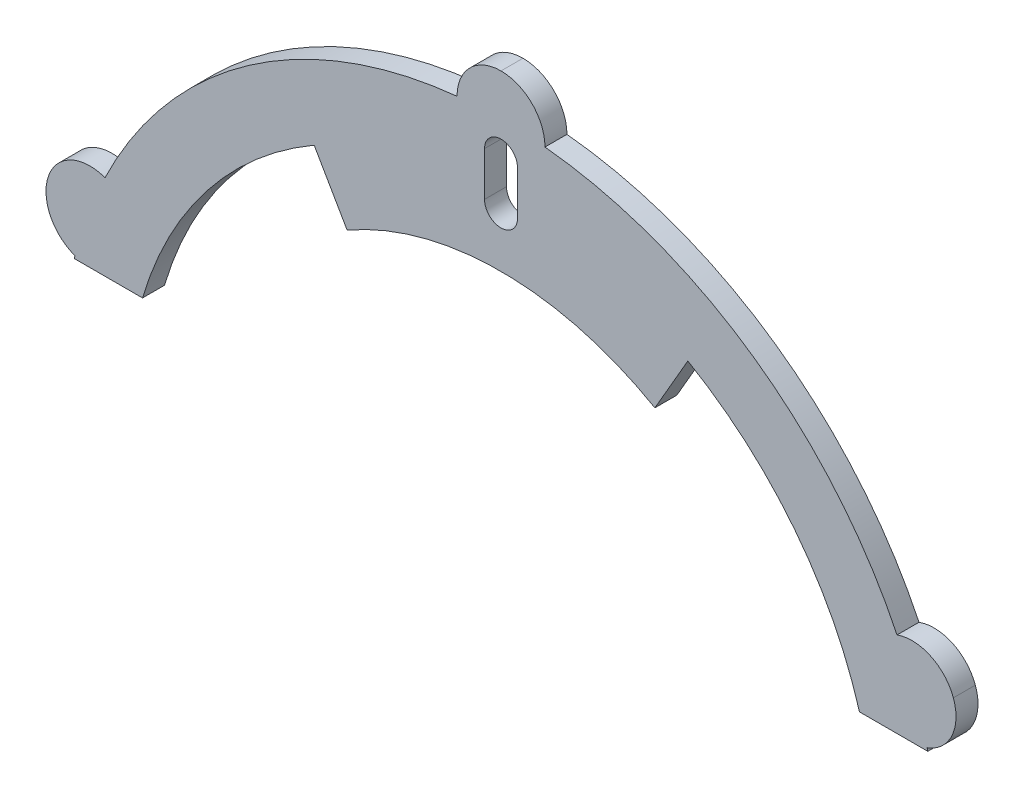
ISO-10303-21;
HEADER;
FILE_DESCRIPTION(('STEP AP214'),'2;1');
FILE_NAME('part.step','',(''),(''),'','','');
FILE_SCHEMA(('AUTOMOTIVE_DESIGN { 1 0 10303 214 1 1 1 1 }'));
ENDSEC;
DATA;
#1=APPLICATION_CONTEXT('core data for automotive mechanical design processes');
#2=APPLICATION_PROTOCOL_DEFINITION('international standard','automotive_design',2000,#1);
#3=PRODUCT_CONTEXT('',#1,'mechanical');
#4=PRODUCT('Part','Part','',(#3));
#5=PRODUCT_RELATED_PRODUCT_CATEGORY('part','',(#4));
#6=PRODUCT_DEFINITION_FORMATION('','',#4);
#7=PRODUCT_DEFINITION_CONTEXT('part definition',#1,'design');
#8=PRODUCT_DEFINITION('design','',#6,#7);
#9=PRODUCT_DEFINITION_SHAPE('','',#8);
#10=(LENGTH_UNIT() NAMED_UNIT(*) SI_UNIT(.MILLI.,.METRE.));
#11=(NAMED_UNIT(*) PLANE_ANGLE_UNIT() SI_UNIT($,.RADIAN.));
#12=(NAMED_UNIT(*) SI_UNIT($,.STERADIAN.) SOLID_ANGLE_UNIT());
#13=UNCERTAINTY_MEASURE_WITH_UNIT(LENGTH_MEASURE(1.E-05),#10,'distance_accuracy_value','');
#14=(GEOMETRIC_REPRESENTATION_CONTEXT(3) GLOBAL_UNCERTAINTY_ASSIGNED_CONTEXT((#13)) GLOBAL_UNIT_ASSIGNED_CONTEXT((#10,
#11,#12)) REPRESENTATION_CONTEXT('',''));
#15=CARTESIAN_POINT('',(0.,0.,0.));
#16=DIRECTION('',(0.,0.,1.));
#17=DIRECTION('',(1.,0.,0.));
#18=AXIS2_PLACEMENT_3D('',#15,#16,#17);
#19=CARTESIAN_POINT('',(0.,0.,6.35));
#20=DIRECTION('',(0.,0.,-1.));
#21=DIRECTION('',(-1.,0.,0.));
#22=AXIS2_PLACEMENT_3D('',#19,#20,#21);
#23=CYLINDRICAL_SURFACE('',#22,127.);
#24=CARTESIAN_POINT('',(0.,0.,0.));
#25=DIRECTION('',(0.,0.,1.));
#26=DIRECTION('',(1.,0.,0.));
#27=AXIS2_PLACEMENT_3D('',#24,#25,#26);
#28=CIRCLE('',#27,127.);
#29=CARTESIAN_POINT('',(-12.7,126.363404512541,0.));
#30=VERTEX_POINT('',#29);
#31=CARTESIAN_POINT('',(-114.399102937584,55.1529260064789,0.));
#32=VERTEX_POINT('',#31);
#33=EDGE_CURVE('E170',#30,#32,#28,.T.);
#34=ORIENTED_EDGE('',*,*,#33,.T.);
#35=DIRECTION('',(0.,0.,-1.));
#36=VECTOR('',#35,1.);
#37=CARTESIAN_POINT('',(-114.399102937584,55.1529260064789,6.35));
#38=LINE('',#37,#36);
#39=CARTESIAN_POINT('',(-114.399102937584,55.1529260064789,6.35));
#40=VERTEX_POINT('',#39);
#41=EDGE_CURVE('E290',#40,#32,#38,.T.);
#42=ORIENTED_EDGE('',*,*,#41,.F.);
#43=CARTESIAN_POINT('',(0.,0.,6.35));
#44=DIRECTION('',(0.,0.,1.));
#45=DIRECTION('',(1.,0.,0.));
#46=AXIS2_PLACEMENT_3D('',#43,#44,#45);
#47=CIRCLE('',#46,127.);
#48=CARTESIAN_POINT('',(-12.7,126.363404512541,6.35));
#49=VERTEX_POINT('',#48);
#50=EDGE_CURVE('E204',#49,#40,#47,.T.);
#51=ORIENTED_EDGE('',*,*,#50,.F.);
#52=DIRECTION('',(0.,0.,-1.));
#53=VECTOR('',#52,1.);
#54=CARTESIAN_POINT('',(-12.7,126.363404512541,6.35));
#55=LINE('',#54,#53);
#56=EDGE_CURVE('E233',#49,#30,#55,.T.);
#57=ORIENTED_EDGE('',*,*,#56,.T.);
#58=EDGE_LOOP('',(#34,#42,#51,#57));
#59=FACE_BOUND('',#58,.T.);
#60=ADVANCED_FACE('F32',(#59),#23,.T.);
#61=CARTESIAN_POINT('',(0.,0.,6.35));
#62=DIRECTION('',(0.,0.,-1.));
#63=DIRECTION('',(-1.,0.,0.));
#64=AXIS2_PLACEMENT_3D('',#61,#62,#63);
#65=CYLINDRICAL_SURFACE('',#64,127.);
#66=CARTESIAN_POINT('',(0.,0.,0.));
#67=DIRECTION('',(0.,0.,1.));
#68=DIRECTION('',(1.,0.,0.));
#69=AXIS2_PLACEMENT_3D('',#66,#67,#68);
#70=CIRCLE('',#69,127.);
#71=CARTESIAN_POINT('',(-123.086414578055,31.2847334385168,0.));
#72=VERTEX_POINT('',#71);
#73=CARTESIAN_POINT('',(-123.288156771038,30.48,0.));
#74=VERTEX_POINT('',#73);
#75=EDGE_CURVE('E173',#72,#74,#70,.T.);
#76=ORIENTED_EDGE('',*,*,#75,.T.);
#77=DIRECTION('',(0.,0.,-1.));
#78=VECTOR('',#77,1.);
#79=CARTESIAN_POINT('',(-123.288156771038,30.48,6.35));
#80=LINE('',#79,#78);
#81=CARTESIAN_POINT('',(-123.288156771038,30.48,6.35));
#82=VERTEX_POINT('',#81);
#83=EDGE_CURVE('E284',#82,#74,#80,.T.);
#84=ORIENTED_EDGE('',*,*,#83,.F.);
#85=CARTESIAN_POINT('',(0.,0.,6.35));
#86=DIRECTION('',(0.,0.,1.));
#87=DIRECTION('',(1.,0.,0.));
#88=AXIS2_PLACEMENT_3D('',#85,#86,#87);
#89=CIRCLE('',#88,127.);
#90=CARTESIAN_POINT('',(-123.086414578055,31.2847334385168,6.35));
#91=VERTEX_POINT('',#90);
#92=EDGE_CURVE('E207',#91,#82,#89,.T.);
#93=ORIENTED_EDGE('',*,*,#92,.F.);
#94=DIRECTION('',(0.,0.,-1.));
#95=VECTOR('',#94,1.);
#96=CARTESIAN_POINT('',(-123.086414578055,31.2847334385168,6.35));
#97=LINE('',#96,#95);
#98=EDGE_CURVE('E287',#91,#72,#97,.T.);
#99=ORIENTED_EDGE('',*,*,#98,.T.);
#100=EDGE_LOOP('',(#76,#84,#93,#99));
#101=FACE_BOUND('',#100,.T.);
#102=ADVANCED_FACE('F322',(#101),#65,.T.);
#103=CARTESIAN_POINT('',(-123.288156771038,30.48,6.35));
#104=DIRECTION('',(0.,1.,0.));
#105=DIRECTION('',(-1.,0.,0.));
#106=AXIS2_PLACEMENT_3D('',#103,#104,#105);
#107=PLANE('',#106);
#108=DIRECTION('',(1.,0.,0.));
#109=VECTOR('',#108,1.);
#110=CARTESIAN_POINT('',(-123.288156771038,30.48,0.));
#111=LINE('',#110,#109);
#112=CARTESIAN_POINT('',(-103.557578670033,30.48,0.));
#113=VERTEX_POINT('',#112);
#114=EDGE_CURVE('E236',#74,#113,#111,.T.);
#115=ORIENTED_EDGE('',*,*,#114,.T.);
#116=DIRECTION('',(0.,0.,-1.));
#117=VECTOR('',#116,1.);
#118=CARTESIAN_POINT('',(-103.557578670033,30.48,6.35));
#119=LINE('',#118,#117);
#120=CARTESIAN_POINT('',(-103.557578670033,30.48,6.35));
#121=VERTEX_POINT('',#120);
#122=EDGE_CURVE('E281',#121,#113,#119,.T.);
#123=ORIENTED_EDGE('',*,*,#122,.F.);
#124=DIRECTION('',(1.,0.,0.));
#125=VECTOR('',#124,1.);
#126=CARTESIAN_POINT('',(-123.288156771038,30.48,6.35));
#127=LINE('',#126,#125);
#128=EDGE_CURVE('E211',#82,#121,#127,.T.);
#129=ORIENTED_EDGE('',*,*,#128,.F.);
#130=ORIENTED_EDGE('',*,*,#83,.T.);
#131=EDGE_LOOP('',(#115,#123,#129,#130));
#132=FACE_BOUND('',#131,.T.);
#133=ADVANCED_FACE('F401',(#132),#107,.F.);
#134=CARTESIAN_POINT('',(0.,0.,6.35));
#135=DIRECTION('',(0.,0.,-1.));
#136=DIRECTION('',(-1.,0.,0.));
#137=AXIS2_PLACEMENT_3D('',#134,#135,#136);
#138=CYLINDRICAL_SURFACE('',#137,107.95);
#139=CARTESIAN_POINT('',(0.,0.,0.));
#140=DIRECTION('',(0.,0.,-1.));
#141=DIRECTION('',(1.,0.,0.));
#142=AXIS2_PLACEMENT_3D('',#139,#140,#141);
#143=CIRCLE('',#142,107.95);
#144=CARTESIAN_POINT('',(-53.9749999999995,93.4874423385304,0.));
#145=VERTEX_POINT('',#144);
#146=EDGE_CURVE('E238',#113,#145,#143,.T.);
#147=ORIENTED_EDGE('',*,*,#146,.T.);
#148=DIRECTION('',(0.,0.,-1.));
#149=VECTOR('',#148,1.);
#150=CARTESIAN_POINT('',(-53.9749999999995,93.4874423385304,6.35));
#151=LINE('',#150,#149);
#152=CARTESIAN_POINT('',(-53.9749999999995,93.4874423385304,6.35));
#153=VERTEX_POINT('',#152);
#154=EDGE_CURVE('E278',#153,#145,#151,.T.);
#155=ORIENTED_EDGE('',*,*,#154,.F.);
#156=CARTESIAN_POINT('',(0.,0.,6.35));
#157=DIRECTION('',(0.,0.,-1.));
#158=DIRECTION('',(1.,0.,0.));
#159=AXIS2_PLACEMENT_3D('',#156,#157,#158);
#160=CIRCLE('',#159,107.95);
#161=EDGE_CURVE('E214',#121,#153,#160,.T.);
#162=ORIENTED_EDGE('',*,*,#161,.F.);
#163=ORIENTED_EDGE('',*,*,#122,.T.);
#164=EDGE_LOOP('',(#147,#155,#162,#163));
#165=FACE_BOUND('',#164,.T.);
#166=ADVANCED_FACE('F398',(#165),#138,.F.);
#167=CARTESIAN_POINT('',(-44.4499999999996,76.9896583964368,6.35));
#168=DIRECTION('',(0.866025403784441,0.499999999999995,0.));
#169=DIRECTION('',(-0.499999999999995,0.866025403784441,0.));
#170=AXIS2_PLACEMENT_3D('',#167,#168,#169);
#171=PLANE('',#170);
#172=DIRECTION('',(0.499999999999995,-0.866025403784441,0.));
#173=VECTOR('',#172,1.);
#174=CARTESIAN_POINT('',(-44.4499999999996,76.9896583964368,0.));
#175=LINE('',#174,#173);
#176=CARTESIAN_POINT('',(-44.4499999999996,76.9896583964368,0.));
#177=VERTEX_POINT('',#176);
#178=EDGE_CURVE('E240',#145,#177,#175,.T.);
#179=ORIENTED_EDGE('',*,*,#178,.T.);
#180=DIRECTION('',(0.,0.,-1.));
#181=VECTOR('',#180,1.);
#182=CARTESIAN_POINT('',(-44.4499999999996,76.9896583964368,6.35));
#183=LINE('',#182,#181);
#184=CARTESIAN_POINT('',(-44.4499999999996,76.9896583964368,6.35));
#185=VERTEX_POINT('',#184);
#186=EDGE_CURVE('E275',#185,#177,#183,.T.);
#187=ORIENTED_EDGE('',*,*,#186,.F.);
#188=DIRECTION('',(0.499999999999995,-0.866025403784441,0.));
#189=VECTOR('',#188,1.);
#190=CARTESIAN_POINT('',(-44.4499999999996,76.9896583964368,6.35));
#191=LINE('',#190,#189);
#192=EDGE_CURVE('E217',#153,#185,#191,.T.);
#193=ORIENTED_EDGE('',*,*,#192,.F.);
#194=ORIENTED_EDGE('',*,*,#154,.T.);
#195=EDGE_LOOP('',(#179,#187,#193,#194));
#196=FACE_BOUND('',#195,.T.);
#197=ADVANCED_FACE('F393',(#196),#171,.F.);
#198=CARTESIAN_POINT('',(0.,0.,6.35));
#199=DIRECTION('',(0.,0.,-1.));
#200=DIRECTION('',(-1.,0.,0.));
#201=AXIS2_PLACEMENT_3D('',#198,#199,#200);
#202=CYLINDRICAL_SURFACE('',#201,88.9);
#203=CARTESIAN_POINT('',(0.,0.,0.));
#204=DIRECTION('',(0.,0.,-1.));
#205=DIRECTION('',(1.,0.,0.));
#206=AXIS2_PLACEMENT_3D('',#203,#204,#205);
#207=CIRCLE('',#206,88.9);
#208=CARTESIAN_POINT('',(44.4499999999996,76.9896583964368,0.));
#209=VERTEX_POINT('',#208);
#210=EDGE_CURVE('E242',#177,#209,#207,.T.);
#211=ORIENTED_EDGE('',*,*,#210,.T.);
#212=DIRECTION('',(0.,0.,-1.));
#213=VECTOR('',#212,1.);
#214=CARTESIAN_POINT('',(44.4499999999996,76.9896583964368,6.35));
#215=LINE('',#214,#213);
#216=CARTESIAN_POINT('',(44.4499999999996,76.9896583964368,6.35));
#217=VERTEX_POINT('',#216);
#218=EDGE_CURVE('E272',#217,#209,#215,.T.);
#219=ORIENTED_EDGE('',*,*,#218,.F.);
#220=CARTESIAN_POINT('',(0.,0.,6.35));
#221=DIRECTION('',(0.,0.,-1.));
#222=DIRECTION('',(1.,0.,0.));
#223=AXIS2_PLACEMENT_3D('',#220,#221,#222);
#224=CIRCLE('',#223,88.9);
#225=EDGE_CURVE('E220',#185,#217,#224,.T.);
#226=ORIENTED_EDGE('',*,*,#225,.F.);
#227=ORIENTED_EDGE('',*,*,#186,.T.);
#228=EDGE_LOOP('',(#211,#219,#226,#227));
#229=FACE_BOUND('',#228,.T.);
#230=ADVANCED_FACE('F388',(#229),#202,.F.);
#231=CARTESIAN_POINT('',(44.4499999999996,76.9896583964368,6.35));
#232=DIRECTION('',(-0.866025403784441,0.499999999999995,0.));
#233=DIRECTION('',(-0.499999999999995,-0.866025403784441,0.));
#234=AXIS2_PLACEMENT_3D('',#231,#232,#233);
#235=PLANE('',#234);
#236=DIRECTION('',(0.499999999999995,0.866025403784441,0.));
#237=VECTOR('',#236,1.);
#238=CARTESIAN_POINT('',(44.4499999999996,76.9896583964368,0.));
#239=LINE('',#238,#237);
#240=CARTESIAN_POINT('',(53.9749999999995,93.4874423385304,0.));
#241=VERTEX_POINT('',#240);
#242=EDGE_CURVE('E244',#209,#241,#239,.T.);
#243=ORIENTED_EDGE('',*,*,#242,.T.);
#244=DIRECTION('',(0.,0.,-1.));
#245=VECTOR('',#244,1.);
#246=CARTESIAN_POINT('',(53.9749999999995,93.4874423385304,6.35));
#247=LINE('',#246,#245);
#248=CARTESIAN_POINT('',(53.9749999999995,93.4874423385304,6.35));
#249=VERTEX_POINT('',#248);
#250=EDGE_CURVE('E269',#249,#241,#247,.T.);
#251=ORIENTED_EDGE('',*,*,#250,.F.);
#252=DIRECTION('',(0.499999999999995,0.866025403784441,0.));
#253=VECTOR('',#252,1.);
#254=CARTESIAN_POINT('',(44.4499999999996,76.9896583964368,6.35));
#255=LINE('',#254,#253);
#256=EDGE_CURVE('E223',#217,#249,#255,.T.);
#257=ORIENTED_EDGE('',*,*,#256,.F.);
#258=ORIENTED_EDGE('',*,*,#218,.T.);
#259=EDGE_LOOP('',(#243,#251,#257,#258));
#260=FACE_BOUND('',#259,.T.);
#261=ADVANCED_FACE('F384',(#260),#235,.F.);
#262=CARTESIAN_POINT('',(0.,0.,6.35));
#263=DIRECTION('',(0.,0.,-1.));
#264=DIRECTION('',(-1.,0.,0.));
#265=AXIS2_PLACEMENT_3D('',#262,#263,#264);
#266=CYLINDRICAL_SURFACE('',#265,107.95);
#267=CARTESIAN_POINT('',(0.,0.,0.));
#268=DIRECTION('',(0.,0.,-1.));
#269=DIRECTION('',(1.,0.,0.));
#270=AXIS2_PLACEMENT_3D('',#267,#268,#269);
#271=CIRCLE('',#270,107.95);
#272=CARTESIAN_POINT('',(103.557578670033,30.48,0.));
#273=VERTEX_POINT('',#272);
#274=EDGE_CURVE('E246',#241,#273,#271,.T.);
#275=ORIENTED_EDGE('',*,*,#274,.T.);
#276=DIRECTION('',(0.,0.,-1.));
#277=VECTOR('',#276,1.);
#278=CARTESIAN_POINT('',(103.557578670033,30.48,6.35));
#279=LINE('',#278,#277);
#280=CARTESIAN_POINT('',(103.557578670033,30.48,6.35));
#281=VERTEX_POINT('',#280);
#282=EDGE_CURVE('E266',#281,#273,#279,.T.);
#283=ORIENTED_EDGE('',*,*,#282,.F.);
#284=CARTESIAN_POINT('',(0.,0.,6.35));
#285=DIRECTION('',(0.,0.,-1.));
#286=DIRECTION('',(1.,0.,0.));
#287=AXIS2_PLACEMENT_3D('',#284,#285,#286);
#288=CIRCLE('',#287,107.95);
#289=EDGE_CURVE('E226',#249,#281,#288,.T.);
#290=ORIENTED_EDGE('',*,*,#289,.F.);
#291=ORIENTED_EDGE('',*,*,#250,.T.);
#292=EDGE_LOOP('',(#275,#283,#290,#291));
#293=FACE_BOUND('',#292,.T.);
#294=ADVANCED_FACE('F379',(#293),#266,.F.);
#295=CARTESIAN_POINT('',(103.557578670033,30.48,6.35));
#296=DIRECTION('',(0.,1.,0.));
#297=DIRECTION('',(-1.,0.,0.));
#298=AXIS2_PLACEMENT_3D('',#295,#296,#297);
#299=PLANE('',#298);
#300=DIRECTION('',(1.,0.,0.));
#301=VECTOR('',#300,1.);
#302=CARTESIAN_POINT('',(103.557578670033,30.48,0.));
#303=LINE('',#302,#301);
#304=CARTESIAN_POINT('',(123.288156771038,30.48,0.));
#305=VERTEX_POINT('',#304);
#306=EDGE_CURVE('E248',#273,#305,#303,.T.);
#307=ORIENTED_EDGE('',*,*,#306,.T.);
#308=DIRECTION('',(0.,0.,-1.));
#309=VECTOR('',#308,1.);
#310=CARTESIAN_POINT('',(123.288156771038,30.48,6.35));
#311=LINE('',#310,#309);
#312=CARTESIAN_POINT('',(123.288156771038,30.48,6.35));
#313=VERTEX_POINT('',#312);
#314=EDGE_CURVE('E263',#313,#305,#311,.T.);
#315=ORIENTED_EDGE('',*,*,#314,.F.);
#316=DIRECTION('',(1.,0.,0.));
#317=VECTOR('',#316,1.);
#318=CARTESIAN_POINT('',(103.557578670033,30.48,6.35));
#319=LINE('',#318,#317);
#320=EDGE_CURVE('E229',#281,#313,#319,.T.);
#321=ORIENTED_EDGE('',*,*,#320,.F.);
#322=ORIENTED_EDGE('',*,*,#282,.T.);
#323=EDGE_LOOP('',(#307,#315,#321,#322));
#324=FACE_BOUND('',#323,.T.);
#325=ADVANCED_FACE('F373',(#324),#299,.F.);
#326=CARTESIAN_POINT('',(0.,0.,6.35));
#327=DIRECTION('',(0.,0.,-1.));
#328=DIRECTION('',(-1.,0.,0.));
#329=AXIS2_PLACEMENT_3D('',#326,#327,#328);
#330=CYLINDRICAL_SURFACE('',#329,127.);
#331=CARTESIAN_POINT('',(0.,0.,0.));
#332=DIRECTION('',(0.,0.,1.));
#333=DIRECTION('',(1.,0.,0.));
#334=AXIS2_PLACEMENT_3D('',#331,#332,#333);
#335=CIRCLE('',#334,127.);
#336=CARTESIAN_POINT('',(123.086414578056,31.2847334385169,0.));
#337=VERTEX_POINT('',#336);
#338=EDGE_CURVE('E250',#305,#337,#335,.T.);
#339=ORIENTED_EDGE('',*,*,#338,.T.);
#340=DIRECTION('',(0.,0.,-1.));
#341=VECTOR('',#340,1.);
#342=CARTESIAN_POINT('',(123.086414578056,31.2847334385169,6.35));
#343=LINE('',#342,#341);
#344=CARTESIAN_POINT('',(123.086414578056,31.2847334385169,6.35));
#345=VERTEX_POINT('',#344);
#346=EDGE_CURVE('E261',#345,#337,#343,.T.);
#347=ORIENTED_EDGE('',*,*,#346,.F.);
#348=CARTESIAN_POINT('',(0.,0.,6.35));
#349=DIRECTION('',(0.,0.,1.));
#350=DIRECTION('',(1.,0.,0.));
#351=AXIS2_PLACEMENT_3D('',#348,#349,#350);
#352=CIRCLE('',#351,127.);
#353=EDGE_CURVE('E153',#313,#345,#352,.T.);
#354=ORIENTED_EDGE('',*,*,#353,.F.);
#355=ORIENTED_EDGE('',*,*,#314,.T.);
#356=EDGE_LOOP('',(#339,#347,#354,#355));
#357=FACE_BOUND('',#356,.T.);
#358=ADVANCED_FACE('F369',(#357),#330,.T.);
#359=CARTESIAN_POINT('',(0.,0.,6.35));
#360=DIRECTION('',(0.,0.,-1.));
#361=DIRECTION('',(-1.,0.,0.));
#362=AXIS2_PLACEMENT_3D('',#359,#360,#361);
#363=CYLINDRICAL_SURFACE('',#362,127.);
#364=CARTESIAN_POINT('',(0.,0.,0.));
#365=DIRECTION('',(0.,0.,1.));
#366=DIRECTION('',(1.,0.,0.));
#367=AXIS2_PLACEMENT_3D('',#364,#365,#366);
#368=CIRCLE('',#367,127.);
#369=CARTESIAN_POINT('',(114.399102937584,55.1529260064789,0.));
#370=VERTEX_POINT('',#369);
#371=CARTESIAN_POINT('',(12.7,126.363404512541,0.));
#372=VERTEX_POINT('',#371);
#373=EDGE_CURVE('E208',#370,#372,#368,.T.);
#374=ORIENTED_EDGE('',*,*,#373,.T.);
#375=DIRECTION('',(0.,0.,-1.));
#376=VECTOR('',#375,1.);
#377=CARTESIAN_POINT('',(12.7,126.363404512541,6.35));
#378=LINE('',#377,#376);
#379=CARTESIAN_POINT('',(12.7,126.363404512541,6.35));
#380=VERTEX_POINT('',#379);
#381=EDGE_CURVE('E257',#380,#372,#378,.T.);
#382=ORIENTED_EDGE('',*,*,#381,.F.);
#383=CARTESIAN_POINT('',(0.,0.,6.35));
#384=DIRECTION('',(0.,0.,1.));
#385=DIRECTION('',(1.,0.,0.));
#386=AXIS2_PLACEMENT_3D('',#383,#384,#385);
#387=CIRCLE('',#386,127.);
#388=CARTESIAN_POINT('',(114.399102937584,55.1529260064789,6.35));
#389=VERTEX_POINT('',#388);
#390=EDGE_CURVE('E232',#389,#380,#387,.T.);
#391=ORIENTED_EDGE('',*,*,#390,.F.);
#392=DIRECTION('',(0.,0.,-1.));
#393=VECTOR('',#392,1.);
#394=CARTESIAN_POINT('',(114.399102937584,55.1529260064789,6.35));
#395=LINE('',#394,#393);
#396=EDGE_CURVE('E165',#389,#370,#395,.T.);
#397=ORIENTED_EDGE('',*,*,#396,.T.);
#398=EDGE_LOOP('',(#374,#382,#391,#397));
#399=FACE_BOUND('',#398,.T.);
#400=ADVANCED_FACE('F365',(#399),#363,.T.);
#401=CARTESIAN_POINT('',(0.,0.,6.35));
#402=DIRECTION('',(0.,0.,1.));
#403=DIRECTION('',(1.,0.,0.));
#404=AXIS2_PLACEMENT_3D('',#401,#402,#403);
#405=PLANE('',#404);
#406=CARTESIAN_POINT('',(0.,117.237500593983,6.35));
#407=DIRECTION('',(0.,0.,1.));
#408=DIRECTION('',(1.,0.,0.));
#409=AXIS2_PLACEMENT_3D('',#406,#407,#408);
#410=CIRCLE('',#409,4.7625);
#411=CARTESIAN_POINT('',(4.76250000000001,117.237500593983,6.35));
#412=VERTEX_POINT('',#411);
#413=CARTESIAN_POINT('',(-4.76249800006969,117.241865148048,6.35));
#414=VERTEX_POINT('',#413);
#415=EDGE_CURVE('E36',#412,#414,#410,.T.);
#416=ORIENTED_EDGE('',*,*,#415,.F.);
#417=DIRECTION('',(0.,1.,0.));
#418=VECTOR('',#417,1.);
#419=CARTESIAN_POINT('',(4.76250000000001,104.537500593983,6.35));
#420=LINE('',#419,#418);
#421=CARTESIAN_POINT('',(4.76250000000001,104.537500593983,6.35));
#422=VERTEX_POINT('',#421);
#423=EDGE_CURVE('E77',#422,#412,#420,.T.);
#424=ORIENTED_EDGE('',*,*,#423,.F.);
#425=CARTESIAN_POINT('',(0.,104.537500593983,6.35));
#426=DIRECTION('',(0.,0.,1.));
#427=DIRECTION('',(1.,0.,0.));
#428=AXIS2_PLACEMENT_3D('',#425,#426,#427);
#429=CIRCLE('',#428,4.76250000244525);
#430=CARTESIAN_POINT('',(-4.76249799884706,104.541870481193,6.35));
#431=VERTEX_POINT('',#430);
#432=EDGE_CURVE('E183',#431,#422,#429,.T.);
#433=ORIENTED_EDGE('',*,*,#432,.F.);
#434=DIRECTION('',(0.,1.,0.));
#435=VECTOR('',#434,1.);
#436=CARTESIAN_POINT('',(-4.76249800006969,104.541870481195,6.35));
#437=LINE('',#436,#435);
#438=EDGE_CURVE('E181',#414,#431,#437,.F.);
#439=ORIENTED_EDGE('',*,*,#438,.F.);
#440=EDGE_LOOP('',(#416,#424,#433,#439));
#441=FACE_BOUND('',#440,.T.);
#442=ORIENTED_EDGE('',*,*,#353,.T.);
#443=CARTESIAN_POINT('',(118.74275875782,43.2188297224979,6.35));
#444=DIRECTION('',(0.,0.,1.));
#445=DIRECTION('',(1.,0.,0.));
#446=AXIS2_PLACEMENT_3D('',#443,#444,#445);
#447=CIRCLE('',#446,12.7);
#448=CARTESIAN_POINT('',(130.676855041801,47.5624855427338,6.35));
#449=VERTEX_POINT('',#448);
#450=EDGE_CURVE('E11',#345,#449,#447,.T.);
#451=ORIENTED_EDGE('',*,*,#450,.T.);
#452=CARTESIAN_POINT('',(118.74275875782,43.2188297224979,6.35));
#453=DIRECTION('',(0.,0.,1.));
#454=DIRECTION('',(1.,0.,0.));
#455=AXIS2_PLACEMENT_3D('',#452,#453,#454);
#456=CIRCLE('',#455,12.7);
#457=EDGE_CURVE('E41',#449,#389,#456,.T.);
#458=ORIENTED_EDGE('',*,*,#457,.T.);
#459=ORIENTED_EDGE('',*,*,#390,.T.);
#460=CARTESIAN_POINT('',(0.,126.363404512541,6.35));
#461=DIRECTION('',(0.,0.,1.));
#462=DIRECTION('',(1.,0.,0.));
#463=AXIS2_PLACEMENT_3D('',#460,#461,#462);
#464=CIRCLE('',#463,12.7);
#465=CARTESIAN_POINT('',(0.,139.063404512541,6.35));
#466=VERTEX_POINT('',#465);
#467=EDGE_CURVE('E303',#380,#466,#464,.T.);
#468=ORIENTED_EDGE('',*,*,#467,.T.);
#469=CARTESIAN_POINT('',(0.,126.363404512541,6.35));
#470=DIRECTION('',(0.,0.,1.));
#471=DIRECTION('',(1.,0.,0.));
#472=AXIS2_PLACEMENT_3D('',#469,#470,#471);
#473=CIRCLE('',#472,12.7);
#474=EDGE_CURVE('E305',#466,#49,#473,.T.);
#475=ORIENTED_EDGE('',*,*,#474,.T.);
#476=ORIENTED_EDGE('',*,*,#50,.T.);
#477=CARTESIAN_POINT('',(-118.74275875782,43.2188297224979,6.35));
#478=DIRECTION('',(0.,0.,1.));
#479=DIRECTION('',(1.,0.,0.));
#480=AXIS2_PLACEMENT_3D('',#477,#478,#479);
#481=CIRCLE('',#480,12.7);
#482=CARTESIAN_POINT('',(-130.676855041801,47.5624855427338,6.35));
#483=VERTEX_POINT('',#482);
#484=EDGE_CURVE('E308',#40,#483,#481,.T.);
#485=ORIENTED_EDGE('',*,*,#484,.T.);
#486=CARTESIAN_POINT('',(-118.74275875782,43.2188297224979,6.35));
#487=DIRECTION('',(0.,0.,1.));
#488=DIRECTION('',(1.,0.,0.));
#489=AXIS2_PLACEMENT_3D('',#486,#487,#488);
#490=CIRCLE('',#489,12.7);
#491=EDGE_CURVE('E166',#483,#91,#490,.T.);
#492=ORIENTED_EDGE('',*,*,#491,.T.);
#493=ORIENTED_EDGE('',*,*,#92,.T.);
#494=ORIENTED_EDGE('',*,*,#128,.T.);
#495=ORIENTED_EDGE('',*,*,#161,.T.);
#496=ORIENTED_EDGE('',*,*,#192,.T.);
#497=ORIENTED_EDGE('',*,*,#225,.T.);
#498=ORIENTED_EDGE('',*,*,#256,.T.);
#499=ORIENTED_EDGE('',*,*,#289,.T.);
#500=ORIENTED_EDGE('',*,*,#320,.T.);
#501=EDGE_LOOP('',(#442,#451,#458,#459,#468,#475,#476,#485,#492,#493,#494,#495,#496,#497,#498,
#499,#500));
#502=FACE_BOUND('',#501,.T.);
#503=ADVANCED_FACE('F146',(#441,#502),#405,.T.);
#504=CARTESIAN_POINT('',(0.,0.,0.));
#505=DIRECTION('',(0.,0.,1.));
#506=DIRECTION('',(1.,0.,0.));
#507=AXIS2_PLACEMENT_3D('',#504,#505,#506);
#508=PLANE('',#507);
#509=DIRECTION('',(0.,1.,0.));
#510=VECTOR('',#509,1.);
#511=CARTESIAN_POINT('',(4.76250000000001,104.537500593983,0.));
#512=LINE('',#511,#510);
#513=CARTESIAN_POINT('',(4.76250000000001,104.537500593983,0.));
#514=VERTEX_POINT('',#513);
#515=CARTESIAN_POINT('',(4.76250000000001,117.237500593983,0.));
#516=VERTEX_POINT('',#515);
#517=EDGE_CURVE('E200',#514,#516,#512,.T.);
#518=ORIENTED_EDGE('',*,*,#517,.T.);
#519=CARTESIAN_POINT('',(0.,117.237500593983,0.));
#520=DIRECTION('',(0.,0.,1.));
#521=DIRECTION('',(1.,0.,0.));
#522=AXIS2_PLACEMENT_3D('',#519,#520,#521);
#523=CIRCLE('',#522,4.7625);
#524=CARTESIAN_POINT('',(-4.76249800006969,117.241865148048,0.));
#525=VERTEX_POINT('',#524);
#526=EDGE_CURVE('E589',#516,#525,#523,.T.);
#527=ORIENTED_EDGE('',*,*,#526,.T.);
#528=DIRECTION('',(0.,-1.,0.));
#529=VECTOR('',#528,1.);
#530=CARTESIAN_POINT('',(-4.76249800006969,104.541870481195,0.));
#531=LINE('',#530,#529);
#532=CARTESIAN_POINT('',(-4.76249800006969,104.541870481193,0.));
#533=VERTEX_POINT('',#532);
#534=EDGE_CURVE('E592',#525,#533,#531,.T.);
#535=ORIENTED_EDGE('',*,*,#534,.T.);
#536=CARTESIAN_POINT('',(0.,104.537500593983,0.));
#537=DIRECTION('',(0.,0.,1.));
#538=DIRECTION('',(1.,0.,0.));
#539=AXIS2_PLACEMENT_3D('',#536,#537,#538);
#540=CIRCLE('',#539,4.76250000244525);
#541=EDGE_CURVE('E58',#533,#514,#540,.T.);
#542=ORIENTED_EDGE('',*,*,#541,.T.);
#543=EDGE_LOOP('',(#518,#527,#535,#542));
#544=FACE_BOUND('',#543,.T.);
#545=CARTESIAN_POINT('',(118.74275875782,43.2188297224979,0.));
#546=DIRECTION('',(0.,0.,1.));
#547=DIRECTION('',(1.,0.,0.));
#548=AXIS2_PLACEMENT_3D('',#545,#546,#547);
#549=CIRCLE('',#548,12.7);
#550=CARTESIAN_POINT('',(130.676855041801,47.5624855427338,0.));
#551=VERTEX_POINT('',#550);
#552=EDGE_CURVE('E300',#370,#551,#549,.F.);
#553=ORIENTED_EDGE('',*,*,#552,.T.);
#554=CARTESIAN_POINT('',(118.74275875782,43.2188297224979,0.));
#555=DIRECTION('',(0.,0.,1.));
#556=DIRECTION('',(1.,0.,0.));
#557=AXIS2_PLACEMENT_3D('',#554,#555,#556);
#558=CIRCLE('',#557,12.7);
#559=EDGE_CURVE('E169',#551,#337,#558,.F.);
#560=ORIENTED_EDGE('',*,*,#559,.T.);
#561=ORIENTED_EDGE('',*,*,#338,.F.);
#562=ORIENTED_EDGE('',*,*,#306,.F.);
#563=ORIENTED_EDGE('',*,*,#274,.F.);
#564=ORIENTED_EDGE('',*,*,#242,.F.);
#565=ORIENTED_EDGE('',*,*,#210,.F.);
#566=ORIENTED_EDGE('',*,*,#178,.F.);
#567=ORIENTED_EDGE('',*,*,#146,.F.);
#568=ORIENTED_EDGE('',*,*,#114,.F.);
#569=ORIENTED_EDGE('',*,*,#75,.F.);
#570=CARTESIAN_POINT('',(-118.74275875782,43.2188297224979,0.));
#571=DIRECTION('',(0.,0.,1.));
#572=DIRECTION('',(1.,0.,0.));
#573=AXIS2_PLACEMENT_3D('',#570,#571,#572);
#574=CIRCLE('',#573,12.7);
#575=CARTESIAN_POINT('',(-130.676855041801,47.5624855427338,0.));
#576=VERTEX_POINT('',#575);
#577=EDGE_CURVE('E298',#72,#576,#574,.F.);
#578=ORIENTED_EDGE('',*,*,#577,.T.);
#579=CARTESIAN_POINT('',(-118.74275875782,43.2188297224979,0.));
#580=DIRECTION('',(0.,0.,1.));
#581=DIRECTION('',(1.,0.,0.));
#582=AXIS2_PLACEMENT_3D('',#579,#580,#581);
#583=CIRCLE('',#582,12.7);
#584=EDGE_CURVE('E86',#576,#32,#583,.F.);
#585=ORIENTED_EDGE('',*,*,#584,.T.);
#586=ORIENTED_EDGE('',*,*,#33,.F.);
#587=CARTESIAN_POINT('',(0.,126.363404512541,0.));
#588=DIRECTION('',(0.,0.,1.));
#589=DIRECTION('',(1.,0.,0.));
#590=AXIS2_PLACEMENT_3D('',#587,#588,#589);
#591=CIRCLE('',#590,12.7);
#592=CARTESIAN_POINT('',(0.,139.063404512541,0.));
#593=VERTEX_POINT('',#592);
#594=EDGE_CURVE('E295',#30,#593,#591,.F.);
#595=ORIENTED_EDGE('',*,*,#594,.T.);
#596=CARTESIAN_POINT('',(0.,126.363404512541,0.));
#597=DIRECTION('',(0.,0.,1.));
#598=DIRECTION('',(1.,0.,0.));
#599=AXIS2_PLACEMENT_3D('',#596,#597,#598);
#600=CIRCLE('',#599,12.7);
#601=EDGE_CURVE('E293',#593,#372,#600,.F.);
#602=ORIENTED_EDGE('',*,*,#601,.T.);
#603=ORIENTED_EDGE('',*,*,#373,.F.);
#604=EDGE_LOOP('',(#553,#560,#561,#562,#563,#564,#565,#566,#567,#568,#569,#578,#585,#586,#595,
#602,#603));
#605=FACE_BOUND('',#604,.T.);
#606=ADVANCED_FACE('F326',(#544,#605),#508,.F.);
#607=CARTESIAN_POINT('',(118.74275875782,43.2188297224979,6.35));
#608=DIRECTION('',(0.,0.,-1.));
#609=DIRECTION('',(-1.,0.,0.));
#610=AXIS2_PLACEMENT_3D('',#607,#608,#609);
#611=CYLINDRICAL_SURFACE('',#610,12.7);
#612=ORIENTED_EDGE('',*,*,#396,.F.);
#613=ORIENTED_EDGE('',*,*,#457,.F.);
#614=DIRECTION('',(0.,0.,-1.));
#615=VECTOR('',#614,1.);
#616=CARTESIAN_POINT('',(130.676855041801,47.5624855427338,6.35));
#617=LINE('',#616,#615);
#618=EDGE_CURVE('E163',#551,#449,#617,.F.);
#619=ORIENTED_EDGE('',*,*,#618,.F.);
#620=ORIENTED_EDGE('',*,*,#552,.F.);
#621=EDGE_LOOP('',(#612,#613,#619,#620));
#622=FACE_BOUND('',#621,.T.);
#623=ADVANCED_FACE('F161',(#622),#611,.T.);
#624=CARTESIAN_POINT('',(118.74275875782,43.2188297224979,6.35));
#625=DIRECTION('',(0.,0.,-1.));
#626=DIRECTION('',(-1.,0.,0.));
#627=AXIS2_PLACEMENT_3D('',#624,#625,#626);
#628=CYLINDRICAL_SURFACE('',#627,12.7);
#629=ORIENTED_EDGE('',*,*,#450,.F.);
#630=ORIENTED_EDGE('',*,*,#346,.T.);
#631=ORIENTED_EDGE('',*,*,#559,.F.);
#632=ORIENTED_EDGE('',*,*,#618,.T.);
#633=EDGE_LOOP('',(#629,#630,#631,#632));
#634=FACE_BOUND('',#633,.T.);
#635=ADVANCED_FACE('F168',(#634),#628,.T.);
#636=CARTESIAN_POINT('',(-118.74275875782,43.2188297224979,6.35));
#637=DIRECTION('',(0.,0.,-1.));
#638=DIRECTION('',(-1.,0.,0.));
#639=AXIS2_PLACEMENT_3D('',#636,#637,#638);
#640=CYLINDRICAL_SURFACE('',#639,12.7);
#641=DIRECTION('',(0.,0.,-1.));
#642=VECTOR('',#641,1.);
#643=CARTESIAN_POINT('',(-130.676855041801,47.5624855427338,6.35));
#644=LINE('',#643,#642);
#645=EDGE_CURVE('E171',#483,#576,#644,.T.);
#646=ORIENTED_EDGE('',*,*,#645,.F.);
#647=ORIENTED_EDGE('',*,*,#484,.F.);
#648=ORIENTED_EDGE('',*,*,#41,.T.);
#649=ORIENTED_EDGE('',*,*,#584,.F.);
#650=EDGE_LOOP('',(#646,#647,#648,#649));
#651=FACE_BOUND('',#650,.T.);
#652=ADVANCED_FACE('F329',(#651),#640,.T.);
#653=CARTESIAN_POINT('',(-118.74275875782,43.2188297224979,6.35));
#654=DIRECTION('',(0.,0.,-1.));
#655=DIRECTION('',(-1.,0.,0.));
#656=AXIS2_PLACEMENT_3D('',#653,#654,#655);
#657=CYLINDRICAL_SURFACE('',#656,12.7);
#658=ORIENTED_EDGE('',*,*,#491,.F.);
#659=ORIENTED_EDGE('',*,*,#645,.T.);
#660=ORIENTED_EDGE('',*,*,#577,.F.);
#661=ORIENTED_EDGE('',*,*,#98,.F.);
#662=EDGE_LOOP('',(#658,#659,#660,#661));
#663=FACE_BOUND('',#662,.T.);
#664=ADVANCED_FACE('F325',(#663),#657,.T.);
#665=CARTESIAN_POINT('',(0.,126.363404512541,6.35));
#666=DIRECTION('',(0.,0.,-1.));
#667=DIRECTION('',(-1.,0.,0.));
#668=AXIS2_PLACEMENT_3D('',#665,#666,#667);
#669=CYLINDRICAL_SURFACE('',#668,12.7);
#670=DIRECTION('',(0.,0.,-1.));
#671=VECTOR('',#670,1.);
#672=CARTESIAN_POINT('',(0.,139.063404512541,6.35));
#673=LINE('',#672,#671);
#674=EDGE_CURVE('E176',#466,#593,#673,.T.);
#675=ORIENTED_EDGE('',*,*,#674,.F.);
#676=ORIENTED_EDGE('',*,*,#467,.F.);
#677=ORIENTED_EDGE('',*,*,#381,.T.);
#678=ORIENTED_EDGE('',*,*,#601,.F.);
#679=EDGE_LOOP('',(#675,#676,#677,#678));
#680=FACE_BOUND('',#679,.T.);
#681=ADVANCED_FACE('F34',(#680),#669,.T.);
#682=CARTESIAN_POINT('',(0.,126.363404512541,6.35));
#683=DIRECTION('',(0.,0.,-1.));
#684=DIRECTION('',(-1.,0.,0.));
#685=AXIS2_PLACEMENT_3D('',#682,#683,#684);
#686=CYLINDRICAL_SURFACE('',#685,12.7);
#687=ORIENTED_EDGE('',*,*,#474,.F.);
#688=ORIENTED_EDGE('',*,*,#674,.T.);
#689=ORIENTED_EDGE('',*,*,#594,.F.);
#690=ORIENTED_EDGE('',*,*,#56,.F.);
#691=EDGE_LOOP('',(#687,#688,#689,#690));
#692=FACE_BOUND('',#691,.T.);
#693=ADVANCED_FACE('F360',(#692),#686,.T.);
#694=CARTESIAN_POINT('',(0.,117.237500593983,0.));
#695=DIRECTION('',(0.,0.,1.));
#696=DIRECTION('',(1.,0.,0.));
#697=AXIS2_PLACEMENT_3D('',#694,#695,#696);
#698=CYLINDRICAL_SURFACE('',#697,4.7625);
#699=ORIENTED_EDGE('',*,*,#415,.T.);
#700=DIRECTION('',(0.,0.,1.));
#701=VECTOR('',#700,1.);
#702=CARTESIAN_POINT('',(-4.76249800006969,117.241865148048,0.));
#703=LINE('',#702,#701);
#704=EDGE_CURVE('E49',#525,#414,#703,.T.);
#705=ORIENTED_EDGE('',*,*,#704,.F.);
#706=ORIENTED_EDGE('',*,*,#526,.F.);
#707=DIRECTION('',(0.,0.,1.));
#708=VECTOR('',#707,1.);
#709=CARTESIAN_POINT('',(4.76250000000001,117.237500593983,0.));
#710=LINE('',#709,#708);
#711=EDGE_CURVE('E184',#516,#412,#710,.T.);
#712=ORIENTED_EDGE('',*,*,#711,.T.);
#713=EDGE_LOOP('',(#699,#705,#706,#712));
#714=FACE_BOUND('',#713,.T.);
#715=ADVANCED_FACE('F188',(#714),#698,.F.);
#716=CARTESIAN_POINT('',(4.76250000000001,104.537500593983,0.));
#717=DIRECTION('',(1.,0.,0.));
#718=DIRECTION('',(0.,0.,-1.));
#719=AXIS2_PLACEMENT_3D('',#716,#717,#718);
#720=PLANE('',#719);
#721=ORIENTED_EDGE('',*,*,#423,.T.);
#722=ORIENTED_EDGE('',*,*,#711,.F.);
#723=ORIENTED_EDGE('',*,*,#517,.F.);
#724=DIRECTION('',(0.,0.,1.));
#725=VECTOR('',#724,1.);
#726=CARTESIAN_POINT('',(4.76250000000001,104.537500593983,0.));
#727=LINE('',#726,#725);
#728=EDGE_CURVE('E197',#514,#422,#727,.T.);
#729=ORIENTED_EDGE('',*,*,#728,.T.);
#730=EDGE_LOOP('',(#721,#722,#723,#729));
#731=FACE_BOUND('',#730,.T.);
#732=ADVANCED_FACE('F427',(#731),#720,.F.);
#733=CARTESIAN_POINT('',(0.,104.537500593983,0.));
#734=DIRECTION('',(0.,0.,1.));
#735=DIRECTION('',(1.,0.,0.));
#736=AXIS2_PLACEMENT_3D('',#733,#734,#735);
#737=CYLINDRICAL_SURFACE('',#736,4.76250000244525);
#738=ORIENTED_EDGE('',*,*,#432,.T.);
#739=ORIENTED_EDGE('',*,*,#728,.F.);
#740=ORIENTED_EDGE('',*,*,#541,.F.);
#741=DIRECTION('',(0.,0.,1.));
#742=VECTOR('',#741,1.);
#743=CARTESIAN_POINT('',(-4.76249799762443,104.541870481193,0.));
#744=LINE('',#743,#742);
#745=EDGE_CURVE('E194',#533,#431,#744,.T.);
#746=ORIENTED_EDGE('',*,*,#745,.T.);
#747=EDGE_LOOP('',(#738,#739,#740,#746));
#748=FACE_BOUND('',#747,.T.);
#749=ADVANCED_FACE('F196',(#748),#737,.F.);
#750=CARTESIAN_POINT('',(-4.76249800006969,104.541870481195,0.));
#751=DIRECTION('',(-1.,0.,0.));
#752=DIRECTION('',(0.,0.,1.));
#753=AXIS2_PLACEMENT_3D('',#750,#751,#752);
#754=PLANE('',#753);
#755=ORIENTED_EDGE('',*,*,#438,.T.);
#756=ORIENTED_EDGE('',*,*,#745,.F.);
#757=ORIENTED_EDGE('',*,*,#534,.F.);
#758=ORIENTED_EDGE('',*,*,#704,.T.);
#759=EDGE_LOOP('',(#755,#756,#757,#758));
#760=FACE_BOUND('',#759,.T.);
#761=ADVANCED_FACE('F193',(#760),#754,.F.);
#762=CLOSED_SHELL('',(#60,#102,#133,#166,#197,#230,#261,#294,#325,#358,#400,#503,#606,#623,#635,
#652,#664,#681,#693,#715,#732,#749,#761));
#763=MANIFOLD_SOLID_BREP('B2',#762);
#764=ADVANCED_BREP_SHAPE_REPRESENTATION('',(#18,#763),#14);
#765=SHAPE_DEFINITION_REPRESENTATION(#9,#764);
ENDSEC;
END-ISO-10303-21;
